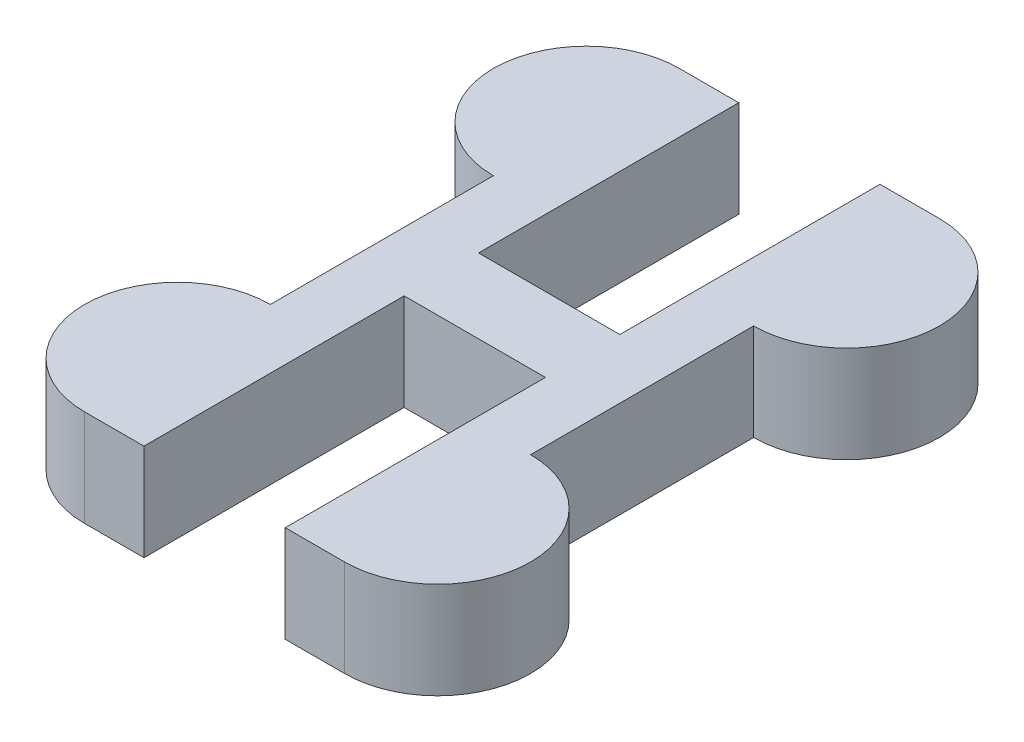
ISO-10303-21;
HEADER;
FILE_DESCRIPTION(('STEP AP214'),'2;1');
FILE_NAME('part.step','',(''),(''),'','','');
FILE_SCHEMA(('AUTOMOTIVE_DESIGN { 1 0 10303 214 1 1 1 1 }'));
ENDSEC;
DATA;
#1=APPLICATION_CONTEXT('core data for automotive mechanical design processes');
#2=APPLICATION_PROTOCOL_DEFINITION('international standard','automotive_design',2000,#1);
#3=PRODUCT_CONTEXT('',#1,'mechanical');
#4=PRODUCT('Part','Part','',(#3));
#5=PRODUCT_RELATED_PRODUCT_CATEGORY('part','',(#4));
#6=PRODUCT_DEFINITION_FORMATION('','',#4);
#7=PRODUCT_DEFINITION_CONTEXT('part definition',#1,'design');
#8=PRODUCT_DEFINITION('design','',#6,#7);
#9=PRODUCT_DEFINITION_SHAPE('','',#8);
#10=(LENGTH_UNIT() NAMED_UNIT(*) SI_UNIT(.MILLI.,.METRE.));
#11=(NAMED_UNIT(*) PLANE_ANGLE_UNIT() SI_UNIT($,.RADIAN.));
#12=(NAMED_UNIT(*) SI_UNIT($,.STERADIAN.) SOLID_ANGLE_UNIT());
#13=UNCERTAINTY_MEASURE_WITH_UNIT(LENGTH_MEASURE(1.E-05),#10,'distance_accuracy_value','');
#14=(GEOMETRIC_REPRESENTATION_CONTEXT(3) GLOBAL_UNCERTAINTY_ASSIGNED_CONTEXT((#13)) GLOBAL_UNIT_ASSIGNED_CONTEXT((#10,
#11,#12)) REPRESENTATION_CONTEXT('',''));
#15=CARTESIAN_POINT('',(0.,0.,0.));
#16=DIRECTION('',(0.,0.,1.));
#17=DIRECTION('',(1.,0.,0.));
#18=AXIS2_PLACEMENT_3D('',#15,#16,#17);
#19=CARTESIAN_POINT('',(-1.75,1.3,-2.75));
#20=DIRECTION('',(0.,-1.,0.));
#21=DIRECTION('',(0.,0.,-1.));
#22=AXIS2_PLACEMENT_3D('',#19,#20,#21);
#23=CYLINDRICAL_SURFACE('',#22,1.25);
#24=CARTESIAN_POINT('',(-1.75,0.,-2.75));
#25=DIRECTION('',(0.,1.,0.));
#26=DIRECTION('',(0.,0.,1.));
#27=AXIS2_PLACEMENT_3D('',#24,#25,#26);
#28=CIRCLE('',#27,1.25);
#29=CARTESIAN_POINT('',(-1.75,0.,-4.));
#30=VERTEX_POINT('',#29);
#31=CARTESIAN_POINT('',(-1.75,0.,-1.5));
#32=VERTEX_POINT('',#31);
#33=EDGE_CURVE('E183',#30,#32,#28,.T.);
#34=ORIENTED_EDGE('',*,*,#33,.T.);
#35=DIRECTION('',(0.,-1.,0.));
#36=VECTOR('',#35,1.);
#37=CARTESIAN_POINT('',(-1.75,1.3,-1.5));
#38=LINE('',#37,#36);
#39=CARTESIAN_POINT('',(-1.75,1.3,-1.5));
#40=VERTEX_POINT('',#39);
#41=EDGE_CURVE('E11',#40,#32,#38,.T.);
#42=ORIENTED_EDGE('',*,*,#41,.F.);
#43=CARTESIAN_POINT('',(-1.75,1.3,-2.75));
#44=DIRECTION('',(0.,1.,0.));
#45=DIRECTION('',(0.,0.,1.));
#46=AXIS2_PLACEMENT_3D('',#43,#44,#45);
#47=CIRCLE('',#46,1.25);
#48=CARTESIAN_POINT('',(-1.75,1.3,-4.));
#49=VERTEX_POINT('',#48);
#50=EDGE_CURVE('E213',#49,#40,#47,.T.);
#51=ORIENTED_EDGE('',*,*,#50,.F.);
#52=DIRECTION('',(0.,-1.,0.));
#53=VECTOR('',#52,1.);
#54=CARTESIAN_POINT('',(-1.75,1.3,-4.));
#55=LINE('',#54,#53);
#56=EDGE_CURVE('E179',#49,#30,#55,.T.);
#57=ORIENTED_EDGE('',*,*,#56,.T.);
#58=EDGE_LOOP('',(#34,#42,#51,#57));
#59=FACE_BOUND('',#58,.T.);
#60=ADVANCED_FACE('F39',(#59),#23,.T.);
#61=CARTESIAN_POINT('',(-1.75,1.3,1.5));
#62=DIRECTION('',(1.,0.,0.));
#63=DIRECTION('',(0.,0.,-1.));
#64=AXIS2_PLACEMENT_3D('',#61,#62,#63);
#65=PLANE('',#64);
#66=DIRECTION('',(0.,0.,1.));
#67=VECTOR('',#66,1.);
#68=CARTESIAN_POINT('',(-1.75,0.,1.5));
#69=LINE('',#68,#67);
#70=CARTESIAN_POINT('',(-1.75,0.,1.5));
#71=VERTEX_POINT('',#70);
#72=EDGE_CURVE('E186',#32,#71,#69,.T.);
#73=ORIENTED_EDGE('',*,*,#72,.T.);
#74=DIRECTION('',(0.,-1.,0.));
#75=VECTOR('',#74,1.);
#76=CARTESIAN_POINT('',(-1.75,1.3,1.5));
#77=LINE('',#76,#75);
#78=CARTESIAN_POINT('',(-1.75,1.3,1.5));
#79=VERTEX_POINT('',#78);
#80=EDGE_CURVE('E47',#79,#71,#77,.T.);
#81=ORIENTED_EDGE('',*,*,#80,.F.);
#82=DIRECTION('',(0.,0.,1.));
#83=VECTOR('',#82,1.);
#84=CARTESIAN_POINT('',(-1.75,1.3,1.5));
#85=LINE('',#84,#83);
#86=EDGE_CURVE('E122',#40,#79,#85,.T.);
#87=ORIENTED_EDGE('',*,*,#86,.F.);
#88=ORIENTED_EDGE('',*,*,#41,.T.);
#89=EDGE_LOOP('',(#73,#81,#87,#88));
#90=FACE_BOUND('',#89,.T.);
#91=ADVANCED_FACE('F311',(#90),#65,.F.);
#92=CARTESIAN_POINT('',(-1.75,1.3,2.75));
#93=DIRECTION('',(0.,-1.,0.));
#94=DIRECTION('',(0.,0.,-1.));
#95=AXIS2_PLACEMENT_3D('',#92,#93,#94);
#96=CYLINDRICAL_SURFACE('',#95,1.25);
#97=CARTESIAN_POINT('',(-1.75,0.,2.75));
#98=DIRECTION('',(0.,1.,0.));
#99=DIRECTION('',(0.,0.,1.));
#100=AXIS2_PLACEMENT_3D('',#97,#98,#99);
#101=CIRCLE('',#100,1.25);
#102=CARTESIAN_POINT('',(-1.75,0.,4.));
#103=VERTEX_POINT('',#102);
#104=EDGE_CURVE('E188',#71,#103,#101,.T.);
#105=ORIENTED_EDGE('',*,*,#104,.T.);
#106=DIRECTION('',(0.,-1.,0.));
#107=VECTOR('',#106,1.);
#108=CARTESIAN_POINT('',(-1.75,1.3,4.));
#109=LINE('',#108,#107);
#110=CARTESIAN_POINT('',(-1.75,1.3,4.));
#111=VERTEX_POINT('',#110);
#112=EDGE_CURVE('E244',#111,#103,#109,.T.);
#113=ORIENTED_EDGE('',*,*,#112,.F.);
#114=CARTESIAN_POINT('',(-1.75,1.3,2.75));
#115=DIRECTION('',(0.,1.,0.));
#116=DIRECTION('',(0.,0.,1.));
#117=AXIS2_PLACEMENT_3D('',#114,#115,#116);
#118=CIRCLE('',#117,1.25);
#119=EDGE_CURVE('E252',#79,#111,#118,.T.);
#120=ORIENTED_EDGE('',*,*,#119,.F.);
#121=ORIENTED_EDGE('',*,*,#80,.T.);
#122=EDGE_LOOP('',(#105,#113,#120,#121));
#123=FACE_BOUND('',#122,.T.);
#124=ADVANCED_FACE('F250',(#123),#96,.T.);
#125=CARTESIAN_POINT('',(-1.75,1.3,4.));
#126=DIRECTION('',(0.,0.,-1.));
#127=DIRECTION('',(-1.,0.,0.));
#128=AXIS2_PLACEMENT_3D('',#125,#126,#127);
#129=PLANE('',#128);
#130=DIRECTION('',(1.,0.,0.));
#131=VECTOR('',#130,1.);
#132=CARTESIAN_POINT('',(-1.75,0.,4.));
#133=LINE('',#132,#131);
#134=CARTESIAN_POINT('',(-0.95,0.,4.));
#135=VERTEX_POINT('',#134);
#136=EDGE_CURVE('E190',#103,#135,#133,.T.);
#137=ORIENTED_EDGE('',*,*,#136,.T.);
#138=DIRECTION('',(0.,-1.,0.));
#139=VECTOR('',#138,1.);
#140=CARTESIAN_POINT('',(-0.95,1.3,4.));
#141=LINE('',#140,#139);
#142=CARTESIAN_POINT('',(-0.95,1.3,4.));
#143=VERTEX_POINT('',#142);
#144=EDGE_CURVE('E241',#143,#135,#141,.T.);
#145=ORIENTED_EDGE('',*,*,#144,.F.);
#146=DIRECTION('',(1.,0.,0.));
#147=VECTOR('',#146,1.);
#148=CARTESIAN_POINT('',(-1.75,1.3,4.));
#149=LINE('',#148,#147);
#150=EDGE_CURVE('E270',#111,#143,#149,.T.);
#151=ORIENTED_EDGE('',*,*,#150,.F.);
#152=ORIENTED_EDGE('',*,*,#112,.T.);
#153=EDGE_LOOP('',(#137,#145,#151,#152));
#154=FACE_BOUND('',#153,.T.);
#155=ADVANCED_FACE('F261',(#154),#129,.F.);
#156=CARTESIAN_POINT('',(-0.950000000000001,1.3,0.500000000000002));
#157=DIRECTION('',(-1.,0.,0.));
#158=DIRECTION('',(0.,0.,1.));
#159=AXIS2_PLACEMENT_3D('',#156,#157,#158);
#160=PLANE('',#159);
#161=DIRECTION('',(0.,0.,-1.));
#162=VECTOR('',#161,1.);
#163=CARTESIAN_POINT('',(-0.950000000000001,0.,0.500000000000002));
#164=LINE('',#163,#162);
#165=CARTESIAN_POINT('',(-0.950000000000001,0.,0.500000000000002));
#166=VERTEX_POINT('',#165);
#167=EDGE_CURVE('E192',#135,#166,#164,.T.);
#168=ORIENTED_EDGE('',*,*,#167,.T.);
#169=DIRECTION('',(0.,-1.,0.));
#170=VECTOR('',#169,1.);
#171=CARTESIAN_POINT('',(-0.950000000000001,1.3,0.500000000000002));
#172=LINE('',#171,#170);
#173=CARTESIAN_POINT('',(-0.950000000000001,1.3,0.500000000000002));
#174=VERTEX_POINT('',#173);
#175=EDGE_CURVE('E238',#174,#166,#172,.T.);
#176=ORIENTED_EDGE('',*,*,#175,.F.);
#177=DIRECTION('',(0.,0.,-1.));
#178=VECTOR('',#177,1.);
#179=CARTESIAN_POINT('',(-0.950000000000001,1.3,0.500000000000002));
#180=LINE('',#179,#178);
#181=EDGE_CURVE('E267',#143,#174,#180,.T.);
#182=ORIENTED_EDGE('',*,*,#181,.F.);
#183=ORIENTED_EDGE('',*,*,#144,.T.);
#184=EDGE_LOOP('',(#168,#176,#182,#183));
#185=FACE_BOUND('',#184,.T.);
#186=ADVANCED_FACE('F265',(#185),#160,.F.);
#187=CARTESIAN_POINT('',(0.949999999999999,1.3,0.500000000000002));
#188=DIRECTION('',(0.,0.,-1.));
#189=DIRECTION('',(-1.,0.,0.));
#190=AXIS2_PLACEMENT_3D('',#187,#188,#189);
#191=PLANE('',#190);
#192=DIRECTION('',(1.,0.,0.));
#193=VECTOR('',#192,1.);
#194=CARTESIAN_POINT('',(0.949999999999999,0.,0.500000000000002));
#195=LINE('',#194,#193);
#196=CARTESIAN_POINT('',(0.949999999999999,0.,0.500000000000002));
#197=VERTEX_POINT('',#196);
#198=EDGE_CURVE('E194',#166,#197,#195,.T.);
#199=ORIENTED_EDGE('',*,*,#198,.T.);
#200=DIRECTION('',(0.,-1.,0.));
#201=VECTOR('',#200,1.);
#202=CARTESIAN_POINT('',(0.949999999999999,1.3,0.500000000000002));
#203=LINE('',#202,#201);
#204=CARTESIAN_POINT('',(0.949999999999999,1.3,0.500000000000002));
#205=VERTEX_POINT('',#204);
#206=EDGE_CURVE('E235',#205,#197,#203,.T.);
#207=ORIENTED_EDGE('',*,*,#206,.F.);
#208=DIRECTION('',(1.,0.,0.));
#209=VECTOR('',#208,1.);
#210=CARTESIAN_POINT('',(0.949999999999999,1.3,0.500000000000002));
#211=LINE('',#210,#209);
#212=EDGE_CURVE('E269',#174,#205,#211,.T.);
#213=ORIENTED_EDGE('',*,*,#212,.F.);
#214=ORIENTED_EDGE('',*,*,#175,.T.);
#215=EDGE_LOOP('',(#199,#207,#213,#214));
#216=FACE_BOUND('',#215,.T.);
#217=ADVANCED_FACE('F324',(#216),#191,.F.);
#218=CARTESIAN_POINT('',(0.949999999999999,1.3,4.));
#219=DIRECTION('',(1.,0.,0.));
#220=DIRECTION('',(0.,0.,-1.));
#221=AXIS2_PLACEMENT_3D('',#218,#219,#220);
#222=PLANE('',#221);
#223=DIRECTION('',(0.,0.,1.));
#224=VECTOR('',#223,1.);
#225=CARTESIAN_POINT('',(0.949999999999999,0.,4.));
#226=LINE('',#225,#224);
#227=CARTESIAN_POINT('',(0.949999999999999,0.,4.));
#228=VERTEX_POINT('',#227);
#229=EDGE_CURVE('E196',#197,#228,#226,.T.);
#230=ORIENTED_EDGE('',*,*,#229,.T.);
#231=DIRECTION('',(0.,-1.,0.));
#232=VECTOR('',#231,1.);
#233=CARTESIAN_POINT('',(0.949999999999999,1.3,4.));
#234=LINE('',#233,#232);
#235=CARTESIAN_POINT('',(0.949999999999999,1.3,4.));
#236=VERTEX_POINT('',#235);
#237=EDGE_CURVE('E232',#236,#228,#234,.T.);
#238=ORIENTED_EDGE('',*,*,#237,.F.);
#239=DIRECTION('',(0.,0.,1.));
#240=VECTOR('',#239,1.);
#241=CARTESIAN_POINT('',(0.949999999999999,1.3,4.));
#242=LINE('',#241,#240);
#243=EDGE_CURVE('E272',#205,#236,#242,.T.);
#244=ORIENTED_EDGE('',*,*,#243,.F.);
#245=ORIENTED_EDGE('',*,*,#206,.T.);
#246=EDGE_LOOP('',(#230,#238,#244,#245));
#247=FACE_BOUND('',#246,.T.);
#248=ADVANCED_FACE('F327',(#247),#222,.F.);
#249=CARTESIAN_POINT('',(0.949999999999999,1.3,4.));
#250=DIRECTION('',(0.,0.,-1.));
#251=DIRECTION('',(-1.,0.,0.));
#252=AXIS2_PLACEMENT_3D('',#249,#250,#251);
#253=PLANE('',#252);
#254=DIRECTION('',(1.,0.,0.));
#255=VECTOR('',#254,1.);
#256=CARTESIAN_POINT('',(0.949999999999999,0.,4.));
#257=LINE('',#256,#255);
#258=CARTESIAN_POINT('',(1.75,0.,4.));
#259=VERTEX_POINT('',#258);
#260=EDGE_CURVE('E198',#228,#259,#257,.T.);
#261=ORIENTED_EDGE('',*,*,#260,.T.);
#262=DIRECTION('',(0.,-1.,0.));
#263=VECTOR('',#262,1.);
#264=CARTESIAN_POINT('',(1.75,1.3,4.));
#265=LINE('',#264,#263);
#266=CARTESIAN_POINT('',(1.75,1.3,4.));
#267=VERTEX_POINT('',#266);
#268=EDGE_CURVE('E229',#267,#259,#265,.T.);
#269=ORIENTED_EDGE('',*,*,#268,.F.);
#270=DIRECTION('',(1.,0.,0.));
#271=VECTOR('',#270,1.);
#272=CARTESIAN_POINT('',(0.949999999999999,1.3,4.));
#273=LINE('',#272,#271);
#274=EDGE_CURVE('E278',#236,#267,#273,.T.);
#275=ORIENTED_EDGE('',*,*,#274,.F.);
#276=ORIENTED_EDGE('',*,*,#237,.T.);
#277=EDGE_LOOP('',(#261,#269,#275,#276));
#278=FACE_BOUND('',#277,.T.);
#279=ADVANCED_FACE('F331',(#278),#253,.F.);
#280=CARTESIAN_POINT('',(1.75,1.3,2.75));
#281=DIRECTION('',(0.,-1.,0.));
#282=DIRECTION('',(0.,0.,-1.));
#283=AXIS2_PLACEMENT_3D('',#280,#281,#282);
#284=CYLINDRICAL_SURFACE('',#283,1.25);
#285=CARTESIAN_POINT('',(1.75,0.,2.75));
#286=DIRECTION('',(0.,1.,0.));
#287=DIRECTION('',(0.,0.,1.));
#288=AXIS2_PLACEMENT_3D('',#285,#286,#287);
#289=CIRCLE('',#288,1.25);
#290=CARTESIAN_POINT('',(1.75,0.,1.5));
#291=VERTEX_POINT('',#290);
#292=EDGE_CURVE('E200',#259,#291,#289,.T.);
#293=ORIENTED_EDGE('',*,*,#292,.T.);
#294=DIRECTION('',(0.,-1.,0.));
#295=VECTOR('',#294,1.);
#296=CARTESIAN_POINT('',(1.75,1.3,1.5));
#297=LINE('',#296,#295);
#298=CARTESIAN_POINT('',(1.75,1.3,1.5));
#299=VERTEX_POINT('',#298);
#300=EDGE_CURVE('E226',#299,#291,#297,.T.);
#301=ORIENTED_EDGE('',*,*,#300,.F.);
#302=CARTESIAN_POINT('',(1.75,1.3,2.75));
#303=DIRECTION('',(0.,1.,0.));
#304=DIRECTION('',(0.,0.,1.));
#305=AXIS2_PLACEMENT_3D('',#302,#303,#304);
#306=CIRCLE('',#305,1.25);
#307=EDGE_CURVE('E280',#267,#299,#306,.T.);
#308=ORIENTED_EDGE('',*,*,#307,.F.);
#309=ORIENTED_EDGE('',*,*,#268,.T.);
#310=EDGE_LOOP('',(#293,#301,#308,#309));
#311=FACE_BOUND('',#310,.T.);
#312=ADVANCED_FACE('F335',(#311),#284,.T.);
#313=CARTESIAN_POINT('',(1.75,1.3,1.5));
#314=DIRECTION('',(-1.,0.,0.));
#315=DIRECTION('',(0.,0.,1.));
#316=AXIS2_PLACEMENT_3D('',#313,#314,#315);
#317=PLANE('',#316);
#318=DIRECTION('',(0.,0.,-1.));
#319=VECTOR('',#318,1.);
#320=CARTESIAN_POINT('',(1.75,0.,1.5));
#321=LINE('',#320,#319);
#322=CARTESIAN_POINT('',(1.75,0.,-1.5));
#323=VERTEX_POINT('',#322);
#324=EDGE_CURVE('E202',#291,#323,#321,.T.);
#325=ORIENTED_EDGE('',*,*,#324,.T.);
#326=DIRECTION('',(0.,-1.,0.));
#327=VECTOR('',#326,1.);
#328=CARTESIAN_POINT('',(1.75,1.3,-1.5));
#329=LINE('',#328,#327);
#330=CARTESIAN_POINT('',(1.75,1.3,-1.5));
#331=VERTEX_POINT('',#330);
#332=EDGE_CURVE('E223',#331,#323,#329,.T.);
#333=ORIENTED_EDGE('',*,*,#332,.F.);
#334=DIRECTION('',(0.,0.,-1.));
#335=VECTOR('',#334,1.);
#336=CARTESIAN_POINT('',(1.75,1.3,1.5));
#337=LINE('',#336,#335);
#338=EDGE_CURVE('E282',#299,#331,#337,.T.);
#339=ORIENTED_EDGE('',*,*,#338,.F.);
#340=ORIENTED_EDGE('',*,*,#300,.T.);
#341=EDGE_LOOP('',(#325,#333,#339,#340));
#342=FACE_BOUND('',#341,.T.);
#343=ADVANCED_FACE('F339',(#342),#317,.F.);
#344=CARTESIAN_POINT('',(1.75,1.3,-2.75));
#345=DIRECTION('',(0.,-1.,0.));
#346=DIRECTION('',(0.,0.,-1.));
#347=AXIS2_PLACEMENT_3D('',#344,#345,#346);
#348=CYLINDRICAL_SURFACE('',#347,1.25);
#349=CARTESIAN_POINT('',(1.75,0.,-2.75));
#350=DIRECTION('',(0.,1.,0.));
#351=DIRECTION('',(0.,0.,1.));
#352=AXIS2_PLACEMENT_3D('',#349,#350,#351);
#353=CIRCLE('',#352,1.25);
#354=CARTESIAN_POINT('',(1.75,0.,-4.));
#355=VERTEX_POINT('',#354);
#356=EDGE_CURVE('E204',#323,#355,#353,.T.);
#357=ORIENTED_EDGE('',*,*,#356,.T.);
#358=DIRECTION('',(0.,-1.,0.));
#359=VECTOR('',#358,1.);
#360=CARTESIAN_POINT('',(1.75,1.3,-4.));
#361=LINE('',#360,#359);
#362=CARTESIAN_POINT('',(1.75,1.3,-4.));
#363=VERTEX_POINT('',#362);
#364=EDGE_CURVE('E220',#363,#355,#361,.T.);
#365=ORIENTED_EDGE('',*,*,#364,.F.);
#366=CARTESIAN_POINT('',(1.75,1.3,-2.75));
#367=DIRECTION('',(0.,1.,0.));
#368=DIRECTION('',(0.,0.,1.));
#369=AXIS2_PLACEMENT_3D('',#366,#367,#368);
#370=CIRCLE('',#369,1.25);
#371=EDGE_CURVE('E284',#331,#363,#370,.T.);
#372=ORIENTED_EDGE('',*,*,#371,.F.);
#373=ORIENTED_EDGE('',*,*,#332,.T.);
#374=EDGE_LOOP('',(#357,#365,#372,#373));
#375=FACE_BOUND('',#374,.T.);
#376=ADVANCED_FACE('F343',(#375),#348,.T.);
#377=CARTESIAN_POINT('',(0.949999999999999,1.3,-4.));
#378=DIRECTION('',(0.,0.,1.));
#379=DIRECTION('',(1.,0.,0.));
#380=AXIS2_PLACEMENT_3D('',#377,#378,#379);
#381=PLANE('',#380);
#382=DIRECTION('',(-1.,0.,0.));
#383=VECTOR('',#382,1.);
#384=CARTESIAN_POINT('',(0.949999999999999,0.,-4.));
#385=LINE('',#384,#383);
#386=CARTESIAN_POINT('',(0.949999999999999,0.,-4.));
#387=VERTEX_POINT('',#386);
#388=EDGE_CURVE('E206',#355,#387,#385,.T.);
#389=ORIENTED_EDGE('',*,*,#388,.T.);
#390=DIRECTION('',(0.,-1.,0.));
#391=VECTOR('',#390,1.);
#392=CARTESIAN_POINT('',(0.949999999999999,1.3,-4.));
#393=LINE('',#392,#391);
#394=CARTESIAN_POINT('',(0.949999999999999,1.3,-4.));
#395=VERTEX_POINT('',#394);
#396=EDGE_CURVE('E217',#395,#387,#393,.T.);
#397=ORIENTED_EDGE('',*,*,#396,.F.);
#398=DIRECTION('',(-1.,0.,0.));
#399=VECTOR('',#398,1.);
#400=CARTESIAN_POINT('',(0.949999999999999,1.3,-4.));
#401=LINE('',#400,#399);
#402=EDGE_CURVE('E286',#363,#395,#401,.T.);
#403=ORIENTED_EDGE('',*,*,#402,.F.);
#404=ORIENTED_EDGE('',*,*,#364,.T.);
#405=EDGE_LOOP('',(#389,#397,#403,#404));
#406=FACE_BOUND('',#405,.T.);
#407=ADVANCED_FACE('F292',(#406),#381,.F.);
#408=CARTESIAN_POINT('',(0.949999999999999,1.3,-0.499999999999998));
#409=DIRECTION('',(1.,0.,0.));
#410=DIRECTION('',(0.,0.,-1.));
#411=AXIS2_PLACEMENT_3D('',#408,#409,#410);
#412=PLANE('',#411);
#413=DIRECTION('',(0.,0.,1.));
#414=VECTOR('',#413,1.);
#415=CARTESIAN_POINT('',(0.949999999999999,0.,-0.499999999999998));
#416=LINE('',#415,#414);
#417=CARTESIAN_POINT('',(0.949999999999999,0.,-0.499999999999998));
#418=VERTEX_POINT('',#417);
#419=EDGE_CURVE('E208',#387,#418,#416,.T.);
#420=ORIENTED_EDGE('',*,*,#419,.T.);
#421=DIRECTION('',(0.,-1.,0.));
#422=VECTOR('',#421,1.);
#423=CARTESIAN_POINT('',(0.949999999999999,1.3,-0.499999999999998));
#424=LINE('',#423,#422);
#425=CARTESIAN_POINT('',(0.949999999999999,1.3,-0.499999999999998));
#426=VERTEX_POINT('',#425);
#427=EDGE_CURVE('E174',#426,#418,#424,.T.);
#428=ORIENTED_EDGE('',*,*,#427,.F.);
#429=DIRECTION('',(0.,0.,1.));
#430=VECTOR('',#429,1.);
#431=CARTESIAN_POINT('',(0.949999999999999,1.3,-0.499999999999998));
#432=LINE('',#431,#430);
#433=EDGE_CURVE('E165',#395,#426,#432,.T.);
#434=ORIENTED_EDGE('',*,*,#433,.F.);
#435=ORIENTED_EDGE('',*,*,#396,.T.);
#436=EDGE_LOOP('',(#420,#428,#434,#435));
#437=FACE_BOUND('',#436,.T.);
#438=ADVANCED_FACE('F296',(#437),#412,.F.);
#439=CARTESIAN_POINT('',(-0.950000000000001,1.3,-0.499999999999998));
#440=DIRECTION('',(0.,0.,1.));
#441=DIRECTION('',(1.,0.,0.));
#442=AXIS2_PLACEMENT_3D('',#439,#440,#441);
#443=PLANE('',#442);
#444=DIRECTION('',(-1.,0.,0.));
#445=VECTOR('',#444,1.);
#446=CARTESIAN_POINT('',(-0.950000000000001,0.,-0.499999999999998));
#447=LINE('',#446,#445);
#448=CARTESIAN_POINT('',(-0.950000000000001,0.,-0.499999999999998));
#449=VERTEX_POINT('',#448);
#450=EDGE_CURVE('E173',#418,#449,#447,.T.);
#451=ORIENTED_EDGE('',*,*,#450,.T.);
#452=DIRECTION('',(0.,-1.,0.));
#453=VECTOR('',#452,1.);
#454=CARTESIAN_POINT('',(-0.950000000000001,1.3,-0.499999999999998));
#455=LINE('',#454,#453);
#456=CARTESIAN_POINT('',(-0.950000000000001,1.3,-0.499999999999998));
#457=VERTEX_POINT('',#456);
#458=EDGE_CURVE('E170',#457,#449,#455,.T.);
#459=ORIENTED_EDGE('',*,*,#458,.F.);
#460=DIRECTION('',(-1.,0.,0.));
#461=VECTOR('',#460,1.);
#462=CARTESIAN_POINT('',(-0.950000000000001,1.3,-0.499999999999998));
#463=LINE('',#462,#461);
#464=EDGE_CURVE('E159',#426,#457,#463,.T.);
#465=ORIENTED_EDGE('',*,*,#464,.F.);
#466=ORIENTED_EDGE('',*,*,#427,.T.);
#467=EDGE_LOOP('',(#451,#459,#465,#466));
#468=FACE_BOUND('',#467,.T.);
#469=ADVANCED_FACE('F171',(#468),#443,.F.);
#470=CARTESIAN_POINT('',(-0.95,1.3,-4.));
#471=DIRECTION('',(-1.,0.,0.));
#472=DIRECTION('',(0.,0.,1.));
#473=AXIS2_PLACEMENT_3D('',#470,#471,#472);
#474=PLANE('',#473);
#475=DIRECTION('',(0.,0.,-1.));
#476=VECTOR('',#475,1.);
#477=CARTESIAN_POINT('',(-0.95,0.,-4.));
#478=LINE('',#477,#476);
#479=CARTESIAN_POINT('',(-0.95,0.,-4.));
#480=VERTEX_POINT('',#479);
#481=EDGE_CURVE('E108',#449,#480,#478,.T.);
#482=ORIENTED_EDGE('',*,*,#481,.T.);
#483=DIRECTION('',(0.,-1.,0.));
#484=VECTOR('',#483,1.);
#485=CARTESIAN_POINT('',(-0.95,1.3,-4.));
#486=LINE('',#485,#484);
#487=CARTESIAN_POINT('',(-0.95,1.3,-4.));
#488=VERTEX_POINT('',#487);
#489=EDGE_CURVE('E175',#488,#480,#486,.T.);
#490=ORIENTED_EDGE('',*,*,#489,.F.);
#491=DIRECTION('',(0.,0.,-1.));
#492=VECTOR('',#491,1.);
#493=CARTESIAN_POINT('',(-0.95,1.3,-4.));
#494=LINE('',#493,#492);
#495=EDGE_CURVE('E163',#457,#488,#494,.T.);
#496=ORIENTED_EDGE('',*,*,#495,.F.);
#497=ORIENTED_EDGE('',*,*,#458,.T.);
#498=EDGE_LOOP('',(#482,#490,#496,#497));
#499=FACE_BOUND('',#498,.T.);
#500=ADVANCED_FACE('F177',(#499),#474,.F.);
#501=CARTESIAN_POINT('',(-1.75,1.3,-4.));
#502=DIRECTION('',(0.,0.,1.));
#503=DIRECTION('',(1.,0.,0.));
#504=AXIS2_PLACEMENT_3D('',#501,#502,#503);
#505=PLANE('',#504);
#506=DIRECTION('',(-1.,0.,0.));
#507=VECTOR('',#506,1.);
#508=CARTESIAN_POINT('',(-1.75,0.,-4.));
#509=LINE('',#508,#507);
#510=EDGE_CURVE('E114',#480,#30,#509,.T.);
#511=ORIENTED_EDGE('',*,*,#510,.T.);
#512=ORIENTED_EDGE('',*,*,#56,.F.);
#513=DIRECTION('',(-1.,0.,0.));
#514=VECTOR('',#513,1.);
#515=CARTESIAN_POINT('',(-1.75,1.3,-4.));
#516=LINE('',#515,#514);
#517=EDGE_CURVE('E55',#488,#49,#516,.T.);
#518=ORIENTED_EDGE('',*,*,#517,.F.);
#519=ORIENTED_EDGE('',*,*,#489,.T.);
#520=EDGE_LOOP('',(#511,#512,#518,#519));
#521=FACE_BOUND('',#520,.T.);
#522=ADVANCED_FACE('F300',(#521),#505,.F.);
#523=CARTESIAN_POINT('',(-1.75,1.3,-2.75));
#524=DIRECTION('',(0.,1.,0.));
#525=DIRECTION('',(0.,0.,1.));
#526=AXIS2_PLACEMENT_3D('',#523,#524,#525);
#527=PLANE('',#526);
#528=ORIENTED_EDGE('',*,*,#50,.T.);
#529=ORIENTED_EDGE('',*,*,#86,.T.);
#530=ORIENTED_EDGE('',*,*,#119,.T.);
#531=ORIENTED_EDGE('',*,*,#150,.T.);
#532=ORIENTED_EDGE('',*,*,#181,.T.);
#533=ORIENTED_EDGE('',*,*,#212,.T.);
#534=ORIENTED_EDGE('',*,*,#243,.T.);
#535=ORIENTED_EDGE('',*,*,#274,.T.);
#536=ORIENTED_EDGE('',*,*,#307,.T.);
#537=ORIENTED_EDGE('',*,*,#338,.T.);
#538=ORIENTED_EDGE('',*,*,#371,.T.);
#539=ORIENTED_EDGE('',*,*,#402,.T.);
#540=ORIENTED_EDGE('',*,*,#433,.T.);
#541=ORIENTED_EDGE('',*,*,#464,.T.);
#542=ORIENTED_EDGE('',*,*,#495,.T.);
#543=ORIENTED_EDGE('',*,*,#517,.T.);
#544=EDGE_LOOP('',(#528,#529,#530,#531,#532,#533,#534,#535,#536,#537,#538,#539,#540,#541,#542,#543));
#545=FACE_BOUND('',#544,.T.);
#546=ADVANCED_FACE('F161',(#545),#527,.T.);
#547=CARTESIAN_POINT('',(-1.75,0.,-2.75));
#548=DIRECTION('',(0.,1.,0.));
#549=DIRECTION('',(0.,0.,1.));
#550=AXIS2_PLACEMENT_3D('',#547,#548,#549);
#551=PLANE('',#550);
#552=ORIENTED_EDGE('',*,*,#33,.F.);
#553=ORIENTED_EDGE('',*,*,#510,.F.);
#554=ORIENTED_EDGE('',*,*,#481,.F.);
#555=ORIENTED_EDGE('',*,*,#450,.F.);
#556=ORIENTED_EDGE('',*,*,#419,.F.);
#557=ORIENTED_EDGE('',*,*,#388,.F.);
#558=ORIENTED_EDGE('',*,*,#356,.F.);
#559=ORIENTED_EDGE('',*,*,#324,.F.);
#560=ORIENTED_EDGE('',*,*,#292,.F.);
#561=ORIENTED_EDGE('',*,*,#260,.F.);
#562=ORIENTED_EDGE('',*,*,#229,.F.);
#563=ORIENTED_EDGE('',*,*,#198,.F.);
#564=ORIENTED_EDGE('',*,*,#167,.F.);
#565=ORIENTED_EDGE('',*,*,#136,.F.);
#566=ORIENTED_EDGE('',*,*,#104,.F.);
#567=ORIENTED_EDGE('',*,*,#72,.F.);
#568=EDGE_LOOP('',(#552,#553,#554,#555,#556,#557,#558,#559,#560,#561,#562,#563,#564,#565,#566,#567));
#569=FACE_BOUND('',#568,.T.);
#570=ADVANCED_FACE('F256',(#569),#551,.F.);
#571=CLOSED_SHELL('',(#60,#91,#124,#155,#186,#217,#248,#279,#312,#343,#376,#407,#438,#469,#500,
#522,#546,#570));
#572=MANIFOLD_SOLID_BREP('B2',#571);
#573=ADVANCED_BREP_SHAPE_REPRESENTATION('',(#18,#572),#14);
#574=SHAPE_DEFINITION_REPRESENTATION(#9,#573);
ENDSEC;
END-ISO-10303-21;
